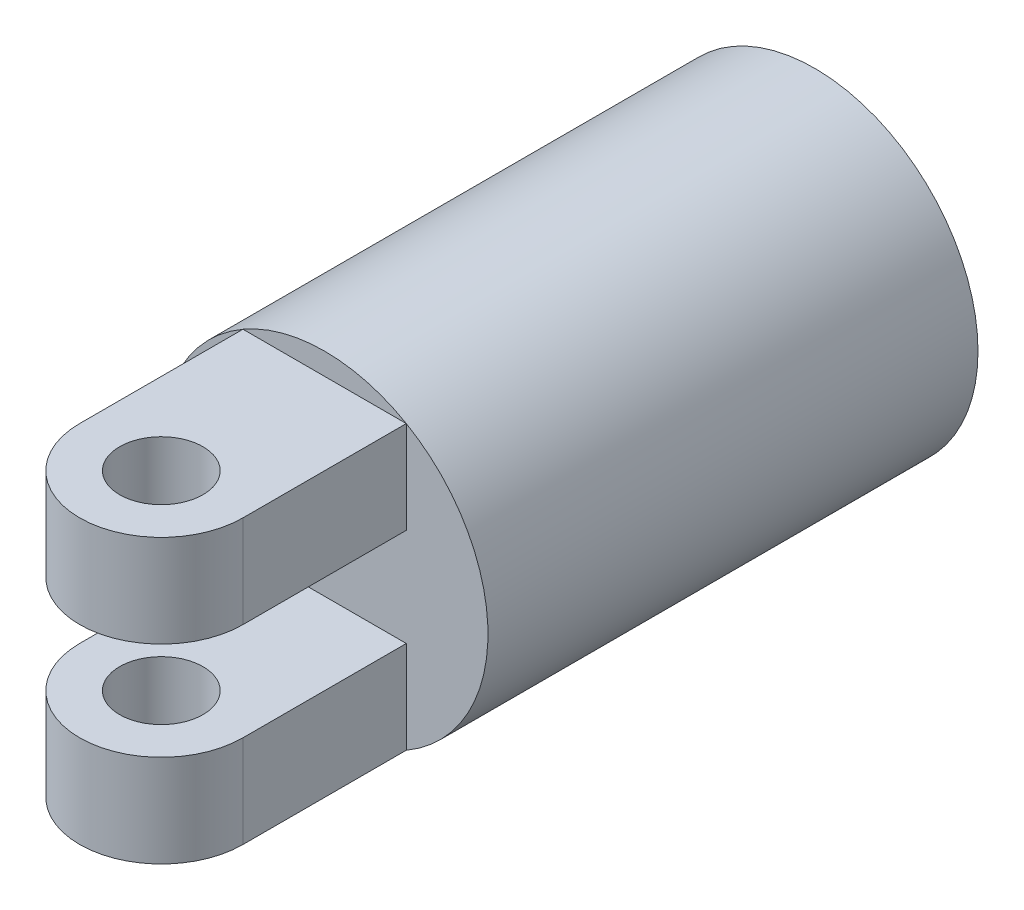
ISO-10303-21;
HEADER;
FILE_DESCRIPTION(('STEP AP214'),'2;1');
FILE_NAME('part.step','',(''),(''),'','','');
FILE_SCHEMA(('AUTOMOTIVE_DESIGN { 1 0 10303 214 1 1 1 1 }'));
ENDSEC;
DATA;
#1=APPLICATION_CONTEXT('core data for automotive mechanical design processes');
#2=APPLICATION_PROTOCOL_DEFINITION('international standard','automotive_design',2000,#1);
#3=PRODUCT_CONTEXT('',#1,'mechanical');
#4=PRODUCT('Part','Part','',(#3));
#5=PRODUCT_RELATED_PRODUCT_CATEGORY('part','',(#4));
#6=PRODUCT_DEFINITION_FORMATION('','',#4);
#7=PRODUCT_DEFINITION_CONTEXT('part definition',#1,'design');
#8=PRODUCT_DEFINITION('design','',#6,#7);
#9=PRODUCT_DEFINITION_SHAPE('','',#8);
#10=(LENGTH_UNIT() NAMED_UNIT(*) SI_UNIT(.MILLI.,.METRE.));
#11=(NAMED_UNIT(*) PLANE_ANGLE_UNIT() SI_UNIT($,.RADIAN.));
#12=(NAMED_UNIT(*) SI_UNIT($,.STERADIAN.) SOLID_ANGLE_UNIT());
#13=UNCERTAINTY_MEASURE_WITH_UNIT(LENGTH_MEASURE(1.E-05),#10,'distance_accuracy_value','');
#14=(GEOMETRIC_REPRESENTATION_CONTEXT(3) GLOBAL_UNCERTAINTY_ASSIGNED_CONTEXT((#13)) GLOBAL_UNIT_ASSIGNED_CONTEXT((#10,
#11,#12)) REPRESENTATION_CONTEXT('',''));
#15=CARTESIAN_POINT('',(0.,0.,0.));
#16=DIRECTION('',(0.,0.,1.));
#17=DIRECTION('',(1.,0.,0.));
#18=AXIS2_PLACEMENT_3D('',#15,#16,#17);
#19=CARTESIAN_POINT('',(5.,26.5104365972799,45.));
#20=DIRECTION('',(1.,0.,0.));
#21=DIRECTION('',(0.,1.,0.));
#22=AXIS2_PLACEMENT_3D('',#19,#20,#21);
#23=PLANE('',#22);
#24=DIRECTION('',(0.,0.,1.));
#25=VECTOR('',#24,1.);
#26=CARTESIAN_POINT('',(5.,20.8501825594355,30.));
#27=LINE('',#26,#25);
#28=CARTESIAN_POINT('',(5.,20.8501825594355,30.));
#29=VERTEX_POINT('',#28);
#30=CARTESIAN_POINT('',(5.,20.8501825594355,40.));
#31=VERTEX_POINT('',#30);
#32=EDGE_CURVE('E111',#29,#31,#27,.T.);
#33=ORIENTED_EDGE('',*,*,#32,.F.);
#34=DIRECTION('',(0.,-1.,0.));
#35=VECTOR('',#34,1.);
#36=CARTESIAN_POINT('',(5.,26.5104365972799,30.));
#37=LINE('',#36,#35);
#38=CARTESIAN_POINT('',(5.,26.5104365972799,30.));
#39=VERTEX_POINT('',#38);
#40=EDGE_CURVE('E125',#39,#29,#37,.T.);
#41=ORIENTED_EDGE('',*,*,#40,.F.);
#42=DIRECTION('',(0.,0.,-1.));
#43=VECTOR('',#42,1.);
#44=CARTESIAN_POINT('',(5.,26.5104365972799,45.));
#45=LINE('',#44,#43);
#46=CARTESIAN_POINT('',(5.,26.5104365972799,40.));
#47=VERTEX_POINT('',#46);
#48=EDGE_CURVE('E144',#47,#39,#45,.T.);
#49=ORIENTED_EDGE('',*,*,#48,.F.);
#50=DIRECTION('',(0.,1.,0.));
#51=VECTOR('',#50,1.);
#52=CARTESIAN_POINT('',(5.,7.85018255943552,40.));
#53=LINE('',#52,#51);
#54=EDGE_CURVE('E203',#31,#47,#53,.T.);
#55=ORIENTED_EDGE('',*,*,#54,.F.);
#56=EDGE_LOOP('',(#33,#41,#49,#55));
#57=FACE_BOUND('',#56,.T.);
#58=ADVANCED_FACE('F41',(#57),#23,.T.);
#59=CARTESIAN_POINT('',(-5.,26.5104365972799,45.));
#60=DIRECTION('',(1.,0.,0.));
#61=DIRECTION('',(0.,1.,0.));
#62=AXIS2_PLACEMENT_3D('',#59,#60,#61);
#63=PLANE('',#62);
#64=DIRECTION('',(0.,-1.,0.));
#65=VECTOR('',#64,1.);
#66=CARTESIAN_POINT('',(-5.,26.5104365972799,30.));
#67=LINE('',#66,#65);
#68=CARTESIAN_POINT('',(-5.,26.5104365972799,30.));
#69=VERTEX_POINT('',#68);
#70=CARTESIAN_POINT('',(-5.,20.8501825594355,30.));
#71=VERTEX_POINT('',#70);
#72=EDGE_CURVE('E136',#69,#71,#67,.T.);
#73=ORIENTED_EDGE('',*,*,#72,.T.);
#74=DIRECTION('',(0.,0.,1.));
#75=VECTOR('',#74,1.);
#76=CARTESIAN_POINT('',(-5.,20.8501825594355,45.));
#77=LINE('',#76,#75);
#78=CARTESIAN_POINT('',(-5.,20.8501825594355,40.));
#79=VERTEX_POINT('',#78);
#80=EDGE_CURVE('E195',#71,#79,#77,.T.);
#81=ORIENTED_EDGE('',*,*,#80,.T.);
#82=DIRECTION('',(0.,1.,0.));
#83=VECTOR('',#82,1.);
#84=CARTESIAN_POINT('',(-5.,7.85018255943552,40.));
#85=LINE('',#84,#83);
#86=CARTESIAN_POINT('',(-5.,26.5104365972799,40.));
#87=VERTEX_POINT('',#86);
#88=EDGE_CURVE('E197',#79,#87,#85,.T.);
#89=ORIENTED_EDGE('',*,*,#88,.T.);
#90=DIRECTION('',(0.,0.,-1.));
#91=VECTOR('',#90,1.);
#92=CARTESIAN_POINT('',(-5.,26.5104365972799,45.));
#93=LINE('',#92,#91);
#94=EDGE_CURVE('E142',#87,#69,#93,.T.);
#95=ORIENTED_EDGE('',*,*,#94,.T.);
#96=EDGE_LOOP('',(#73,#81,#89,#95));
#97=FACE_BOUND('',#96,.T.);
#98=ADVANCED_FACE('F194',(#97),#63,.F.);
#99=CARTESIAN_POINT('',(0.,7.85018255943552,40.));
#100=DIRECTION('',(0.,1.,0.));
#101=DIRECTION('',(0.,0.,1.));
#102=AXIS2_PLACEMENT_3D('',#99,#100,#101);
#103=CYLINDRICAL_SURFACE('',#102,5.);
#104=CARTESIAN_POINT('',(0.,20.8501825594355,40.));
#105=DIRECTION('',(0.,1.,0.));
#106=DIRECTION('',(-1.,0.,0.));
#107=AXIS2_PLACEMENT_3D('',#104,#105,#106);
#108=CIRCLE('',#107,5.);
#109=EDGE_CURVE('E12',#31,#79,#108,.F.);
#110=ORIENTED_EDGE('',*,*,#109,.F.);
#111=ORIENTED_EDGE('',*,*,#54,.T.);
#112=CARTESIAN_POINT('',(0.,26.5104365972799,40.));
#113=DIRECTION('',(0.,1.,0.));
#114=DIRECTION('',(0.,0.,1.));
#115=AXIS2_PLACEMENT_3D('',#112,#113,#114);
#116=CIRCLE('',#115,5.);
#117=EDGE_CURVE('E186',#87,#47,#116,.T.);
#118=ORIENTED_EDGE('',*,*,#117,.F.);
#119=ORIENTED_EDGE('',*,*,#88,.F.);
#120=EDGE_LOOP('',(#110,#111,#118,#119));
#121=FACE_BOUND('',#120,.T.);
#122=ADVANCED_FACE('F202',(#121),#103,.T.);
#123=CARTESIAN_POINT('',(-5.,9.18992852159113,45.));
#124=DIRECTION('',(0.,1.,0.));
#125=DIRECTION('',(0.,0.,1.));
#126=AXIS2_PLACEMENT_3D('',#123,#124,#125);
#127=PLANE('',#126);
#128=CARTESIAN_POINT('',(0.,9.18992852159113,40.));
#129=DIRECTION('',(0.,1.,0.));
#130=DIRECTION('',(0.,0.,1.));
#131=AXIS2_PLACEMENT_3D('',#128,#129,#130);
#132=CIRCLE('',#131,2.55);
#133=CARTESIAN_POINT('',(0.,9.18992852159113,42.55));
#134=VERTEX_POINT('',#133);
#135=EDGE_CURVE('E119',#134,#134,#132,.T.);
#136=ORIENTED_EDGE('',*,*,#135,.T.);
#137=EDGE_LOOP('',(#136));
#138=FACE_BOUND('',#137,.T.);
#139=CARTESIAN_POINT('',(0.,9.18992852159113,40.));
#140=DIRECTION('',(0.,1.,0.));
#141=DIRECTION('',(0.,0.,1.));
#142=AXIS2_PLACEMENT_3D('',#139,#140,#141);
#143=CIRCLE('',#142,5.);
#144=CARTESIAN_POINT('',(-5.,9.18992852159113,40.));
#145=VERTEX_POINT('',#144);
#146=CARTESIAN_POINT('',(5.,9.18992852159113,40.));
#147=VERTEX_POINT('',#146);
#148=EDGE_CURVE('E130',#145,#147,#143,.T.);
#149=ORIENTED_EDGE('',*,*,#148,.F.);
#150=DIRECTION('',(0.,0.,-1.));
#151=VECTOR('',#150,1.);
#152=CARTESIAN_POINT('',(-5.,9.18992852159113,45.));
#153=LINE('',#152,#151);
#154=CARTESIAN_POINT('',(-5.,9.18992852159113,30.));
#155=VERTEX_POINT('',#154);
#156=EDGE_CURVE('E139',#145,#155,#153,.T.);
#157=ORIENTED_EDGE('',*,*,#156,.T.);
#158=DIRECTION('',(1.,0.,0.));
#159=VECTOR('',#158,1.);
#160=CARTESIAN_POINT('',(-5.,9.18992852159113,30.));
#161=LINE('',#160,#159);
#162=CARTESIAN_POINT('',(5.,9.18992852159113,30.));
#163=VERTEX_POINT('',#162);
#164=EDGE_CURVE('E126',#155,#163,#161,.T.);
#165=ORIENTED_EDGE('',*,*,#164,.T.);
#166=DIRECTION('',(0.,0.,-1.));
#167=VECTOR('',#166,1.);
#168=CARTESIAN_POINT('',(5.,9.18992852159113,45.));
#169=LINE('',#168,#167);
#170=EDGE_CURVE('E123',#147,#163,#169,.T.);
#171=ORIENTED_EDGE('',*,*,#170,.F.);
#172=EDGE_LOOP('',(#149,#157,#165,#171));
#173=FACE_BOUND('',#172,.T.);
#174=ADVANCED_FACE('F173',(#138,#173),#127,.F.);
#175=CARTESIAN_POINT('',(-5.,26.5104365972799,45.));
#176=DIRECTION('',(0.,1.,0.));
#177=DIRECTION('',(0.,0.,1.));
#178=AXIS2_PLACEMENT_3D('',#175,#176,#177);
#179=PLANE('',#178);
#180=CARTESIAN_POINT('',(0.,26.5104365972799,40.));
#181=DIRECTION('',(0.,1.,0.));
#182=DIRECTION('',(0.,0.,1.));
#183=AXIS2_PLACEMENT_3D('',#180,#181,#182);
#184=CIRCLE('',#183,2.55);
#185=CARTESIAN_POINT('',(0.,26.5104365972799,42.55));
#186=VERTEX_POINT('',#185);
#187=EDGE_CURVE('E252',#186,#186,#184,.T.);
#188=ORIENTED_EDGE('',*,*,#187,.F.);
#189=EDGE_LOOP('',(#188));
#190=FACE_BOUND('',#189,.T.);
#191=ORIENTED_EDGE('',*,*,#94,.F.);
#192=ORIENTED_EDGE('',*,*,#117,.T.);
#193=ORIENTED_EDGE('',*,*,#48,.T.);
#194=DIRECTION('',(1.,0.,0.));
#195=VECTOR('',#194,1.);
#196=CARTESIAN_POINT('',(-5.,26.5104365972799,30.));
#197=LINE('',#196,#195);
#198=EDGE_CURVE('E129',#69,#39,#197,.T.);
#199=ORIENTED_EDGE('',*,*,#198,.F.);
#200=EDGE_LOOP('',(#191,#192,#193,#199));
#201=FACE_BOUND('',#200,.T.);
#202=ADVANCED_FACE('F181',(#190,#201),#179,.T.);
#203=CARTESIAN_POINT('',(0.,0.,30.));
#204=DIRECTION('',(0.,0.,1.));
#205=DIRECTION('',(1.,0.,0.));
#206=AXIS2_PLACEMENT_3D('',#203,#204,#205);
#207=PLANE('',#206);
#208=ORIENTED_EDGE('',*,*,#164,.F.);
#209=CARTESIAN_POINT('',(0.,17.8501825594355,30.));
#210=DIRECTION('',(0.,0.,1.));
#211=DIRECTION('',(1.,0.,0.));
#212=AXIS2_PLACEMENT_3D('',#209,#210,#211);
#213=CIRCLE('',#212,10.);
#214=EDGE_CURVE('E157',#155,#163,#213,.T.);
#215=ORIENTED_EDGE('',*,*,#214,.T.);
#216=EDGE_LOOP('',(#208,#215));
#217=FACE_BOUND('',#216,.T.);
#218=ADVANCED_FACE('F175',(#217),#207,.T.);
#219=EDGE_CURVE('E148',#39,#69,#213,.T.);
#220=ORIENTED_EDGE('',*,*,#219,.T.);
#221=ORIENTED_EDGE('',*,*,#198,.T.);
#222=EDGE_LOOP('',(#220,#221));
#223=FACE_BOUND('',#222,.T.);
#224=ADVANCED_FACE('F177',(#223),#207,.T.);
#225=CARTESIAN_POINT('',(0.,0.,0.));
#226=DIRECTION('',(0.,0.,1.));
#227=DIRECTION('',(1.,0.,0.));
#228=AXIS2_PLACEMENT_3D('',#225,#226,#227);
#229=PLANE('',#228);
#230=CARTESIAN_POINT('',(0.,17.8501825594355,0.));
#231=DIRECTION('',(0.,0.,-1.));
#232=DIRECTION('',(-1.,0.,0.));
#233=AXIS2_PLACEMENT_3D('',#230,#231,#232);
#234=CIRCLE('',#233,5.05);
#235=CARTESIAN_POINT('',(-5.05,17.8501825594355,0.));
#236=VERTEX_POINT('',#235);
#237=EDGE_CURVE('E247',#236,#236,#234,.T.);
#238=ORIENTED_EDGE('',*,*,#237,.F.);
#239=EDGE_LOOP('',(#238));
#240=FACE_BOUND('',#239,.T.);
#241=CARTESIAN_POINT('',(0.,17.8501825594355,0.));
#242=DIRECTION('',(0.,0.,1.));
#243=DIRECTION('',(1.,0.,0.));
#244=AXIS2_PLACEMENT_3D('',#241,#242,#243);
#245=CIRCLE('',#244,10.);
#246=CARTESIAN_POINT('',(10.,17.8501825594355,0.));
#247=VERTEX_POINT('',#246);
#248=EDGE_CURVE('E147',#247,#247,#245,.T.);
#249=ORIENTED_EDGE('',*,*,#248,.F.);
#250=EDGE_LOOP('',(#249));
#251=FACE_BOUND('',#250,.T.);
#252=ADVANCED_FACE('F234',(#240,#251),#229,.F.);
#253=CARTESIAN_POINT('',(0.,17.8501825594355,30.));
#254=DIRECTION('',(0.,0.,-1.));
#255=DIRECTION('',(-1.,0.,0.));
#256=AXIS2_PLACEMENT_3D('',#253,#254,#255);
#257=CYLINDRICAL_SURFACE('',#256,10.);
#258=ORIENTED_EDGE('',*,*,#219,.F.);
#259=EDGE_CURVE('E152',#163,#39,#213,.T.);
#260=ORIENTED_EDGE('',*,*,#259,.F.);
#261=ORIENTED_EDGE('',*,*,#214,.F.);
#262=EDGE_CURVE('E151',#69,#155,#213,.T.);
#263=ORIENTED_EDGE('',*,*,#262,.F.);
#264=EDGE_LOOP('',(#258,#260,#261,#263));
#265=FACE_BOUND('',#264,.T.);
#266=ORIENTED_EDGE('',*,*,#248,.T.);
#267=EDGE_LOOP('',(#266));
#268=FACE_BOUND('',#267,.T.);
#269=ADVANCED_FACE('F43',(#265,#268),#257,.T.);
#270=CARTESIAN_POINT('',(-5.,14.8501825594355,30.));
#271=VERTEX_POINT('',#270);
#272=EDGE_CURVE('E109',#271,#155,#67,.T.);
#273=ORIENTED_EDGE('',*,*,#272,.F.);
#274=DIRECTION('',(1.,0.,0.));
#275=VECTOR('',#274,1.);
#276=CARTESIAN_POINT('',(-10.,14.8501825594355,30.));
#277=LINE('',#276,#275);
#278=CARTESIAN_POINT('',(5.,14.8501825594355,30.));
#279=VERTEX_POINT('',#278);
#280=EDGE_CURVE('E105',#271,#279,#277,.T.);
#281=ORIENTED_EDGE('',*,*,#280,.T.);
#282=EDGE_CURVE('E65',#279,#163,#37,.T.);
#283=ORIENTED_EDGE('',*,*,#282,.T.);
#284=ORIENTED_EDGE('',*,*,#259,.T.);
#285=ORIENTED_EDGE('',*,*,#40,.T.);
#286=DIRECTION('',(1.,0.,0.));
#287=VECTOR('',#286,1.);
#288=CARTESIAN_POINT('',(-10.,20.8501825594355,30.));
#289=LINE('',#288,#287);
#290=EDGE_CURVE('E110',#71,#29,#289,.T.);
#291=ORIENTED_EDGE('',*,*,#290,.F.);
#292=ORIENTED_EDGE('',*,*,#72,.F.);
#293=ORIENTED_EDGE('',*,*,#262,.T.);
#294=EDGE_LOOP('',(#273,#281,#283,#284,#285,#291,#292,#293));
#295=FACE_BOUND('',#294,.T.);
#296=ADVANCED_FACE('F107',(#295),#207,.T.);
#297=DIRECTION('',(0.,0.,-1.));
#298=VECTOR('',#297,1.);
#299=CARTESIAN_POINT('',(5.,14.8501825594355,30.));
#300=LINE('',#299,#298);
#301=CARTESIAN_POINT('',(5.,14.8501825594355,40.));
#302=VERTEX_POINT('',#301);
#303=EDGE_CURVE('E114',#302,#279,#300,.T.);
#304=ORIENTED_EDGE('',*,*,#303,.F.);
#305=EDGE_CURVE('E205',#147,#302,#53,.T.);
#306=ORIENTED_EDGE('',*,*,#305,.F.);
#307=ORIENTED_EDGE('',*,*,#170,.T.);
#308=ORIENTED_EDGE('',*,*,#282,.F.);
#309=EDGE_LOOP('',(#304,#306,#307,#308));
#310=FACE_BOUND('',#309,.T.);
#311=ADVANCED_FACE('F121',(#310),#23,.T.);
#312=CARTESIAN_POINT('',(-5.,14.8501825594355,40.));
#313=VERTEX_POINT('',#312);
#314=EDGE_CURVE('E200',#145,#313,#85,.T.);
#315=ORIENTED_EDGE('',*,*,#314,.T.);
#316=DIRECTION('',(0.,0.,-1.));
#317=VECTOR('',#316,1.);
#318=CARTESIAN_POINT('',(-5.,14.8501825594355,45.));
#319=LINE('',#318,#317);
#320=EDGE_CURVE('E57',#313,#271,#319,.T.);
#321=ORIENTED_EDGE('',*,*,#320,.T.);
#322=ORIENTED_EDGE('',*,*,#272,.T.);
#323=ORIENTED_EDGE('',*,*,#156,.F.);
#324=EDGE_LOOP('',(#315,#321,#322,#323));
#325=FACE_BOUND('',#324,.T.);
#326=ADVANCED_FACE('F171',(#325),#63,.F.);
#327=CARTESIAN_POINT('',(0.,14.8501825594355,40.));
#328=DIRECTION('',(0.,-1.,0.));
#329=DIRECTION('',(1.,0.,0.));
#330=AXIS2_PLACEMENT_3D('',#327,#328,#329);
#331=CIRCLE('',#330,5.);
#332=EDGE_CURVE('E50',#313,#302,#331,.F.);
#333=ORIENTED_EDGE('',*,*,#332,.F.);
#334=ORIENTED_EDGE('',*,*,#314,.F.);
#335=ORIENTED_EDGE('',*,*,#148,.T.);
#336=ORIENTED_EDGE('',*,*,#305,.T.);
#337=EDGE_LOOP('',(#333,#334,#335,#336));
#338=FACE_BOUND('',#337,.T.);
#339=ADVANCED_FACE('F209',(#338),#103,.T.);
#340=CARTESIAN_POINT('',(-10.,20.8501825594355,30.));
#341=DIRECTION('',(0.,1.,0.));
#342=DIRECTION('',(-1.,0.,0.));
#343=AXIS2_PLACEMENT_3D('',#340,#341,#342);
#344=PLANE('',#343);
#345=CARTESIAN_POINT('',(0.,20.8501825594355,40.));
#346=DIRECTION('',(0.,1.,0.));
#347=DIRECTION('',(-1.,0.,0.));
#348=AXIS2_PLACEMENT_3D('',#345,#346,#347);
#349=CIRCLE('',#348,2.55);
#350=CARTESIAN_POINT('',(0.,20.8501825594355,42.55));
#351=VERTEX_POINT('',#350);
#352=EDGE_CURVE('E257',#351,#351,#349,.T.);
#353=ORIENTED_EDGE('',*,*,#352,.T.);
#354=EDGE_LOOP('',(#353));
#355=FACE_BOUND('',#354,.T.);
#356=ORIENTED_EDGE('',*,*,#290,.T.);
#357=ORIENTED_EDGE('',*,*,#32,.T.);
#358=ORIENTED_EDGE('',*,*,#109,.T.);
#359=ORIENTED_EDGE('',*,*,#80,.F.);
#360=EDGE_LOOP('',(#356,#357,#358,#359));
#361=FACE_BOUND('',#360,.T.);
#362=ADVANCED_FACE('F211',(#355,#361),#344,.F.);
#363=CARTESIAN_POINT('',(-10.,14.8501825594355,30.));
#364=DIRECTION('',(0.,-1.,0.));
#365=DIRECTION('',(1.,0.,0.));
#366=AXIS2_PLACEMENT_3D('',#363,#364,#365);
#367=PLANE('',#366);
#368=CARTESIAN_POINT('',(0.,14.8501825594355,40.));
#369=DIRECTION('',(0.,-1.,0.));
#370=DIRECTION('',(1.,0.,0.));
#371=AXIS2_PLACEMENT_3D('',#368,#369,#370);
#372=CIRCLE('',#371,2.55);
#373=CARTESIAN_POINT('',(0.,14.8501825594355,42.55));
#374=VERTEX_POINT('',#373);
#375=EDGE_CURVE('E45',#374,#374,#372,.T.);
#376=ORIENTED_EDGE('',*,*,#375,.T.);
#377=EDGE_LOOP('',(#376));
#378=FACE_BOUND('',#377,.T.);
#379=ORIENTED_EDGE('',*,*,#332,.T.);
#380=ORIENTED_EDGE('',*,*,#303,.T.);
#381=ORIENTED_EDGE('',*,*,#280,.F.);
#382=ORIENTED_EDGE('',*,*,#320,.F.);
#383=EDGE_LOOP('',(#379,#380,#381,#382));
#384=FACE_BOUND('',#383,.T.);
#385=ADVANCED_FACE('F115',(#378,#384),#367,.F.);
#386=CARTESIAN_POINT('',(0.,7.85018255943552,40.));
#387=DIRECTION('',(0.,1.,0.));
#388=DIRECTION('',(0.,0.,1.));
#389=AXIS2_PLACEMENT_3D('',#386,#387,#388);
#390=CYLINDRICAL_SURFACE('',#389,2.55);
#391=CARTESIAN_POINT('',(0.,14.8501825594355,42.55));
#392=CARTESIAN_POINT('',(0.,14.7912215798746,42.55));
#393=CARTESIAN_POINT('',(0.,14.7322606003138,42.55));
#394=CARTESIAN_POINT('',(0.,14.614338641192,42.55));
#395=CARTESIAN_POINT('',(0.,14.5553776616311,42.55));
#396=CARTESIAN_POINT('',(0.,14.4374557025094,42.55));
#397=CARTESIAN_POINT('',(0.,14.3784947229485,42.55));
#398=CARTESIAN_POINT('',(0.,14.2605727638267,42.55));
#399=CARTESIAN_POINT('',(0.,14.2016117842658,42.55));
#400=CARTESIAN_POINT('',(0.,14.0836898251441,42.55));
#401=CARTESIAN_POINT('',(0.,14.0247288455832,42.55));
#402=CARTESIAN_POINT('',(0.,13.9068068864615,42.55));
#403=CARTESIAN_POINT('',(0.,13.8478459069006,42.55));
#404=CARTESIAN_POINT('',(0.,13.7299239477788,42.55));
#405=CARTESIAN_POINT('',(0.,13.6709629682179,42.55));
#406=CARTESIAN_POINT('',(0.,13.5530410090962,42.55));
#407=CARTESIAN_POINT('',(0.,13.4940800295353,42.55));
#408=CARTESIAN_POINT('',(0.,13.3761580704135,42.55));
#409=CARTESIAN_POINT('',(0.,13.3171970908527,42.55));
#410=CARTESIAN_POINT('',(0.,13.1992751317309,42.55));
#411=CARTESIAN_POINT('',(0.,13.14031415217,42.55));
#412=CARTESIAN_POINT('',(0.,13.0223921930483,42.55));
#413=CARTESIAN_POINT('',(0.,12.9634312134874,42.55));
#414=CARTESIAN_POINT('',(0.,12.8455092543656,42.55));
#415=CARTESIAN_POINT('',(0.,12.7865482748047,42.55));
#416=CARTESIAN_POINT('',(0.,12.668626315683,42.55));
#417=CARTESIAN_POINT('',(0.,12.6096653361221,42.55));
#418=CARTESIAN_POINT('',(0.,12.4917433770004,42.55));
#419=CARTESIAN_POINT('',(0.,12.4327823974395,42.55));
#420=CARTESIAN_POINT('',(0.,12.3148604383177,42.55));
#421=CARTESIAN_POINT('',(0.,12.2558994587568,42.55));
#422=CARTESIAN_POINT('',(0.,12.1379774996351,42.55));
#423=CARTESIAN_POINT('',(0.,12.0790165200742,42.55));
#424=CARTESIAN_POINT('',(0.,11.9610945609524,42.55));
#425=CARTESIAN_POINT('',(0.,11.9021335813916,42.55));
#426=CARTESIAN_POINT('',(0.,11.7842116222698,42.55));
#427=CARTESIAN_POINT('',(0.,11.7252506427089,42.55));
#428=CARTESIAN_POINT('',(0.,11.6073286835872,42.55));
#429=CARTESIAN_POINT('',(0.,11.5483677040263,42.55));
#430=CARTESIAN_POINT('',(0.,11.4304457449045,42.55));
#431=CARTESIAN_POINT('',(0.,11.3714847653437,42.55));
#432=CARTESIAN_POINT('',(0.,11.2535628062219,42.55));
#433=CARTESIAN_POINT('',(0.,11.194601826661,42.55));
#434=CARTESIAN_POINT('',(0.,11.0766798675393,42.55));
#435=CARTESIAN_POINT('',(0.,11.0177188879784,42.55));
#436=CARTESIAN_POINT('',(0.,10.8997969288566,42.55));
#437=CARTESIAN_POINT('',(0.,10.8408359492957,42.55));
#438=CARTESIAN_POINT('',(0.,10.722913990174,42.55));
#439=CARTESIAN_POINT('',(0.,10.6639530106131,42.55));
#440=CARTESIAN_POINT('',(0.,10.5460310514913,42.55));
#441=CARTESIAN_POINT('',(0.,10.4870700719305,42.55));
#442=CARTESIAN_POINT('',(0.,10.3691481128087,42.55));
#443=CARTESIAN_POINT('',(0.,10.3101871332478,42.55));
#444=CARTESIAN_POINT('',(0.,10.1922651741261,42.55));
#445=CARTESIAN_POINT('',(0.,10.1333041945652,42.55));
#446=CARTESIAN_POINT('',(0.,10.0153822354434,42.55));
#447=CARTESIAN_POINT('',(0.,9.95642125588255,42.55));
#448=CARTESIAN_POINT('',(0.,9.8384992967608,42.55));
#449=CARTESIAN_POINT('',(0.,9.77953831719992,42.55));
#450=CARTESIAN_POINT('',(0.,9.66161635807816,42.55));
#451=CARTESIAN_POINT('',(0.,9.60265537851728,42.55));
#452=CARTESIAN_POINT('',(0.,9.48473341939552,42.55));
#453=CARTESIAN_POINT('',(0.,9.42577243983464,42.55));
#454=CARTESIAN_POINT('',(0.,9.30785048071288,42.55));
#455=CARTESIAN_POINT('',(0.,9.24888950115201,42.55));
#456=CARTESIAN_POINT('',(0.,9.18992852159113,42.55));
#457=B_SPLINE_CURVE_WITH_KNOTS('',3,(#391,#392,#393,#394,#395,#396,#397,#398,#399,#400,#401,
#402,#403,#404,#405,#406,#407,#408,#409,#410,#411,#412,#413,#414,#415,#416,#417,#418,#419,#420,
#421,#422,#423,#424,#425,#426,#427,#428,#429,#430,#431,#432,#433,#434,#435,#436,#437,#438,#439,
#440,#441,#442,#443,#444,#445,#446,#447,#448,#449,#450,#451,#452,#453,#454,#455,#456),
.UNSPECIFIED.,.F.,.F.,(4,2,2,2,2,2,2,2,2,2,2,2,2,2,2,2,2,2,2,2,2,2,2,2,2,2,2,2,2,2,2,2,4),(0.,
0.176882938682638,0.353765877365277,0.530648816047911,0.70753175473055,0.884414693413188,
1.06129763209582,1.23818057077846,1.4150635094611,1.59194644814374,1.76882938682637,
1.94571232550901,2.12259526419165,2.29947820287428,2.47636114155692,2.65324408023956,
2.8301270189222,3.00700995760483,3.18389289628747,3.36077583497011,3.53765877365274,
3.71454171233538,3.89142465101802,4.06830758970066,4.24519052838329,4.42207346706593,
4.59895640574857,4.77583934443121,4.95272228311384,5.12960522179648,5.30648816047912,
5.48337109916175,5.66025403784439),.UNSPECIFIED.);
#458=EDGE_CURVE('BSEAM266',#374,#134,#457,.T.);
#459=ORIENTED_EDGE('',*,*,#375,.F.);
#460=ORIENTED_EDGE('',*,*,#135,.F.);
#461=ORIENTED_EDGE('',*,*,#458,.T.);
#462=ORIENTED_EDGE('',*,*,#458,.F.);
#463=EDGE_LOOP('',(#459,#461,#460,#462));
#464=FACE_BOUND('',#463,.T.);
#465=ADVANCED_FACE('F266',(#464),#390,.F.);
#466=CARTESIAN_POINT('',(0.,26.5104365972799,42.55));
#467=CARTESIAN_POINT('',(0.,26.451475617719,42.55));
#468=CARTESIAN_POINT('',(0.,26.3925146381582,42.55));
#469=CARTESIAN_POINT('',(0.,26.2745926790364,42.55));
#470=CARTESIAN_POINT('',(0.,26.2156316994755,42.55));
#471=CARTESIAN_POINT('',(0.,26.0977097403538,42.55));
#472=CARTESIAN_POINT('',(0.,26.0387487607929,42.55));
#473=CARTESIAN_POINT('',(0.,25.9208268016711,42.55));
#474=CARTESIAN_POINT('',(0.,25.8618658221102,42.55));
#475=CARTESIAN_POINT('',(0.,25.7439438629885,42.55));
#476=CARTESIAN_POINT('',(0.,25.6849828834276,42.55));
#477=CARTESIAN_POINT('',(0.,25.5670609243058,42.55));
#478=CARTESIAN_POINT('',(0.,25.508099944745,42.55));
#479=CARTESIAN_POINT('',(0.,25.3901779856232,42.55));
#480=CARTESIAN_POINT('',(0.,25.3312170060623,42.55));
#481=CARTESIAN_POINT('',(0.,25.2132950469406,42.55));
#482=CARTESIAN_POINT('',(0.,25.1543340673797,42.55));
#483=CARTESIAN_POINT('',(0.,25.0364121082579,42.55));
#484=CARTESIAN_POINT('',(0.,24.9774511286971,42.55));
#485=CARTESIAN_POINT('',(0.,24.8595291695753,42.55));
#486=CARTESIAN_POINT('',(0.,24.8005681900144,42.55));
#487=CARTESIAN_POINT('',(0.,24.6826462308927,42.55));
#488=CARTESIAN_POINT('',(0.,24.6236852513318,42.55));
#489=CARTESIAN_POINT('',(0.,24.50576329221,42.55));
#490=CARTESIAN_POINT('',(0.,24.4468023126491,42.55));
#491=CARTESIAN_POINT('',(0.,24.3288803535274,42.55));
#492=CARTESIAN_POINT('',(0.,24.2699193739665,42.55));
#493=CARTESIAN_POINT('',(0.,24.1519974148447,42.55));
#494=CARTESIAN_POINT('',(0.,24.0930364352839,42.55));
#495=CARTESIAN_POINT('',(0.,23.9751144761621,42.55));
#496=CARTESIAN_POINT('',(0.,23.9161534966012,42.55));
#497=CARTESIAN_POINT('',(0.,23.7982315374795,42.55));
#498=CARTESIAN_POINT('',(0.,23.7392705579186,42.55));
#499=CARTESIAN_POINT('',(0.,23.6213485987968,42.55));
#500=CARTESIAN_POINT('',(0.,23.562387619236,42.55));
#501=CARTESIAN_POINT('',(0.,23.4444656601142,42.55));
#502=CARTESIAN_POINT('',(0.,23.3855046805533,42.55));
#503=CARTESIAN_POINT('',(0.,23.2675827214316,42.55));
#504=CARTESIAN_POINT('',(0.,23.2086217418707,42.55));
#505=CARTESIAN_POINT('',(0.,23.0906997827489,42.55));
#506=CARTESIAN_POINT('',(0.,23.031738803188,42.55));
#507=CARTESIAN_POINT('',(0.,22.9138168440663,42.55));
#508=CARTESIAN_POINT('',(0.,22.8548558645054,42.55));
#509=CARTESIAN_POINT('',(0.,22.7369339053836,42.55));
#510=CARTESIAN_POINT('',(0.,22.6779729258228,42.55));
#511=CARTESIAN_POINT('',(0.,22.560050966701,42.55));
#512=CARTESIAN_POINT('',(0.,22.5010899871401,42.55));
#513=CARTESIAN_POINT('',(0.,22.3831680280184,42.55));
#514=CARTESIAN_POINT('',(0.,22.3242070484575,42.55));
#515=CARTESIAN_POINT('',(0.,22.2062850893357,42.55));
#516=CARTESIAN_POINT('',(0.,22.1473241097749,42.55));
#517=CARTESIAN_POINT('',(0.,22.0294021506531,42.55));
#518=CARTESIAN_POINT('',(0.,21.9704411710922,42.55));
#519=CARTESIAN_POINT('',(0.,21.8525192119705,42.55));
#520=CARTESIAN_POINT('',(0.,21.7935582324096,42.55));
#521=CARTESIAN_POINT('',(0.,21.6756362732878,42.55));
#522=CARTESIAN_POINT('',(0.,21.6166752937269,42.55));
#523=CARTESIAN_POINT('',(0.,21.4987533346052,42.55));
#524=CARTESIAN_POINT('',(0.,21.4397923550443,42.55));
#525=CARTESIAN_POINT('',(0.,21.3218703959226,42.55));
#526=CARTESIAN_POINT('',(0.,21.2629094163617,42.55));
#527=CARTESIAN_POINT('',(0.,21.1449874572399,42.55));
#528=CARTESIAN_POINT('',(0.,21.086026477679,42.55));
#529=CARTESIAN_POINT('',(0.,20.9681045185573,42.55));
#530=CARTESIAN_POINT('',(0.,20.9091435389964,42.55));
#531=CARTESIAN_POINT('',(0.,20.8501825594355,42.55));
#532=B_SPLINE_CURVE_WITH_KNOTS('',3,(#466,#467,#468,#469,#470,#471,#472,#473,#474,#475,#476,
#477,#478,#479,#480,#481,#482,#483,#484,#485,#486,#487,#488,#489,#490,#491,#492,#493,#494,#495,
#496,#497,#498,#499,#500,#501,#502,#503,#504,#505,#506,#507,#508,#509,#510,#511,#512,#513,#514,
#515,#516,#517,#518,#519,#520,#521,#522,#523,#524,#525,#526,#527,#528,#529,#530,#531),
.UNSPECIFIED.,.F.,.F.,(4,2,2,2,2,2,2,2,2,2,2,2,2,2,2,2,2,2,2,2,2,2,2,2,2,2,2,2,2,2,2,2,4),(0.,
0.176882938682638,0.353765877365273,0.530648816047911,0.70753175473055,0.884414693413185,
1.06129763209582,1.23818057077846,1.4150635094611,1.59194644814373,1.76882938682637,
1.94571232550901,2.12259526419165,2.29947820287428,2.47636114155692,2.65324408023956,
2.8301270189222,3.00700995760483,3.18389289628747,3.36077583497011,3.53765877365274,
3.71454171233538,3.89142465101802,4.06830758970065,4.24519052838329,4.42207346706593,
4.59895640574856,4.7758393444312,4.95272228311384,5.12960522179648,5.30648816047911,
5.48337109916175,5.66025403784439),.UNSPECIFIED.);
#533=EDGE_CURVE('BSEAM268',#186,#351,#532,.T.);
#534=ORIENTED_EDGE('',*,*,#187,.T.);
#535=ORIENTED_EDGE('',*,*,#352,.F.);
#536=ORIENTED_EDGE('',*,*,#533,.T.);
#537=ORIENTED_EDGE('',*,*,#533,.F.);
#538=EDGE_LOOP('',(#534,#536,#535,#537));
#539=FACE_BOUND('',#538,.T.);
#540=ADVANCED_FACE('F268',(#539),#390,.F.);
#541=CARTESIAN_POINT('',(0.,17.8501825594355,25.));
#542=DIRECTION('',(0.,0.,-1.));
#543=DIRECTION('',(-1.,0.,0.));
#544=AXIS2_PLACEMENT_3D('',#541,#542,#543);
#545=CYLINDRICAL_SURFACE('',#544,5.05);
#546=CARTESIAN_POINT('',(0.,17.8501825594355,25.));
#547=DIRECTION('',(0.,0.,-1.));
#548=DIRECTION('',(-1.,0.,0.));
#549=AXIS2_PLACEMENT_3D('',#546,#547,#548);
#550=CIRCLE('',#549,5.05);
#551=CARTESIAN_POINT('',(-5.05,17.8501825594355,25.));
#552=VERTEX_POINT('',#551);
#553=EDGE_CURVE('E249',#552,#552,#550,.T.);
#554=ORIENTED_EDGE('',*,*,#553,.F.);
#555=EDGE_LOOP('',(#554));
#556=FACE_BOUND('',#555,.T.);
#557=ORIENTED_EDGE('',*,*,#237,.T.);
#558=EDGE_LOOP('',(#557));
#559=FACE_BOUND('',#558,.T.);
#560=ADVANCED_FACE('F275',(#556,#559),#545,.F.);
#561=CARTESIAN_POINT('',(0.,17.8501825594355,25.));
#562=DIRECTION('',(0.,0.,-1.));
#563=DIRECTION('',(-1.,0.,0.));
#564=AXIS2_PLACEMENT_3D('',#561,#562,#563);
#565=PLANE('',#564);
#566=ORIENTED_EDGE('',*,*,#553,.T.);
#567=EDGE_LOOP('',(#566));
#568=FACE_BOUND('',#567,.T.);
#569=ADVANCED_FACE('F282',(#568),#565,.T.);
#570=CLOSED_SHELL('',(#58,#98,#122,#174,#202,#218,#224,#252,#269,#296,#311,#326,#339,#362,#385,
#465,#540,#560,#569));
#571=MANIFOLD_SOLID_BREP('B2',#570);
#572=ADVANCED_BREP_SHAPE_REPRESENTATION('',(#18,#571),#14);
#573=SHAPE_DEFINITION_REPRESENTATION(#9,#572);
ENDSEC;
END-ISO-10303-21;
